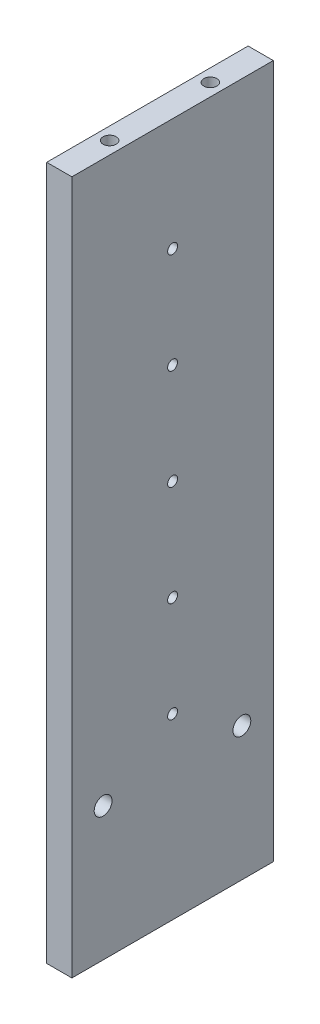
ISO-10303-21;
HEADER;
FILE_DESCRIPTION(('STEP AP214'),'2;1');
FILE_NAME('part.step','',(''),(''),'','','');
FILE_SCHEMA(('AUTOMOTIVE_DESIGN { 1 0 10303 214 1 1 1 1 }'));
ENDSEC;
DATA;
#1=APPLICATION_CONTEXT('core data for automotive mechanical design processes');
#2=APPLICATION_PROTOCOL_DEFINITION('international standard','automotive_design',2000,#1);
#3=PRODUCT_CONTEXT('',#1,'mechanical');
#4=PRODUCT('Part','Part','',(#3));
#5=PRODUCT_RELATED_PRODUCT_CATEGORY('part','',(#4));
#6=PRODUCT_DEFINITION_FORMATION('','',#4);
#7=PRODUCT_DEFINITION_CONTEXT('part definition',#1,'design');
#8=PRODUCT_DEFINITION('design','',#6,#7);
#9=PRODUCT_DEFINITION_SHAPE('','',#8);
#10=(LENGTH_UNIT() NAMED_UNIT(*) SI_UNIT(.MILLI.,.METRE.));
#11=(NAMED_UNIT(*) PLANE_ANGLE_UNIT() SI_UNIT($,.RADIAN.));
#12=(NAMED_UNIT(*) SI_UNIT($,.STERADIAN.) SOLID_ANGLE_UNIT());
#13=UNCERTAINTY_MEASURE_WITH_UNIT(LENGTH_MEASURE(1.E-05),#10,'distance_accuracy_value','');
#14=(GEOMETRIC_REPRESENTATION_CONTEXT(3) GLOBAL_UNCERTAINTY_ASSIGNED_CONTEXT((#13)) GLOBAL_UNIT_ASSIGNED_CONTEXT((#10,
#11,#12)) REPRESENTATION_CONTEXT('',''));
#15=CARTESIAN_POINT('',(0.,0.,0.));
#16=DIRECTION('',(0.,0.,1.));
#17=DIRECTION('',(1.,0.,0.));
#18=AXIS2_PLACEMENT_3D('',#15,#16,#17);
#19=CARTESIAN_POINT('',(0.,175.,0.));
#20=DIRECTION('',(1.,0.,0.));
#21=DIRECTION('',(0.,0.,-1.));
#22=AXIS2_PLACEMENT_3D('',#19,#20,#21);
#23=PLANE('',#22);
#24=CARTESIAN_POINT('',(0.,33.675,-1.524));
#25=DIRECTION('',(1.,0.,0.));
#26=DIRECTION('',(0.,0.,-1.));
#27=AXIS2_PLACEMENT_3D('',#24,#25,#26);
#28=CIRCLE('',#27,2.25);
#29=CARTESIAN_POINT('',(0.,33.675,-3.774));
#30=VERTEX_POINT('',#29);
#31=EDGE_CURVE('E119',#30,#30,#28,.T.);
#32=ORIENTED_EDGE('',*,*,#31,.T.);
#33=EDGE_LOOP('',(#32));
#34=FACE_BOUND('',#33,.T.);
#35=CARTESIAN_POINT('',(0.,33.675,-36.524));
#36=DIRECTION('',(1.,0.,0.));
#37=DIRECTION('',(0.,0.,-1.));
#38=AXIS2_PLACEMENT_3D('',#35,#36,#37);
#39=CIRCLE('',#38,2.25);
#40=CARTESIAN_POINT('',(0.,33.675,-38.774));
#41=VERTEX_POINT('',#40);
#42=EDGE_CURVE('E127',#41,#41,#39,.T.);
#43=ORIENTED_EDGE('',*,*,#42,.T.);
#44=EDGE_LOOP('',(#43));
#45=FACE_BOUND('',#44,.T.);
#46=CARTESIAN_POINT('',(0.,121.2,-19.05));
#47=DIRECTION('',(1.,0.,0.));
#48=DIRECTION('',(0.,0.,-1.));
#49=AXIS2_PLACEMENT_3D('',#46,#47,#48);
#50=CIRCLE('',#49,1.25);
#51=CARTESIAN_POINT('',(0.,121.2,-20.3));
#52=VERTEX_POINT('',#51);
#53=EDGE_CURVE('E169',#52,#52,#50,.T.);
#54=ORIENTED_EDGE('',*,*,#53,.T.);
#55=EDGE_LOOP('',(#54));
#56=FACE_BOUND('',#55,.T.);
#57=CARTESIAN_POINT('',(0.,95.8,-19.05));
#58=DIRECTION('',(1.,0.,0.));
#59=DIRECTION('',(0.,0.,-1.));
#60=AXIS2_PLACEMENT_3D('',#57,#58,#59);
#61=CIRCLE('',#60,1.25);
#62=CARTESIAN_POINT('',(0.,95.8,-20.3));
#63=VERTEX_POINT('',#62);
#64=EDGE_CURVE('E177',#63,#63,#61,.T.);
#65=ORIENTED_EDGE('',*,*,#64,.T.);
#66=EDGE_LOOP('',(#65));
#67=FACE_BOUND('',#66,.T.);
#68=CARTESIAN_POINT('',(0.,70.4,-19.05));
#69=DIRECTION('',(1.,0.,0.));
#70=DIRECTION('',(0.,0.,-1.));
#71=AXIS2_PLACEMENT_3D('',#68,#69,#70);
#72=CIRCLE('',#71,1.25);
#73=CARTESIAN_POINT('',(0.,70.4,-20.3));
#74=VERTEX_POINT('',#73);
#75=EDGE_CURVE('E185',#74,#74,#72,.T.);
#76=ORIENTED_EDGE('',*,*,#75,.T.);
#77=EDGE_LOOP('',(#76));
#78=FACE_BOUND('',#77,.T.);
#79=CARTESIAN_POINT('',(0.,45.,-19.05));
#80=DIRECTION('',(1.,0.,0.));
#81=DIRECTION('',(0.,0.,-1.));
#82=AXIS2_PLACEMENT_3D('',#79,#80,#81);
#83=CIRCLE('',#82,1.25);
#84=CARTESIAN_POINT('',(0.,45.,-20.3));
#85=VERTEX_POINT('',#84);
#86=EDGE_CURVE('E193',#85,#85,#83,.T.);
#87=ORIENTED_EDGE('',*,*,#86,.T.);
#88=EDGE_LOOP('',(#87));
#89=FACE_BOUND('',#88,.T.);
#90=CARTESIAN_POINT('',(0.,146.6,-19.05));
#91=DIRECTION('',(1.,0.,0.));
#92=DIRECTION('',(0.,0.,-1.));
#93=AXIS2_PLACEMENT_3D('',#90,#91,#92);
#94=CIRCLE('',#93,1.25);
#95=CARTESIAN_POINT('',(0.,146.6,-20.3));
#96=VERTEX_POINT('',#95);
#97=EDGE_CURVE('E201',#96,#96,#94,.T.);
#98=ORIENTED_EDGE('',*,*,#97,.T.);
#99=EDGE_LOOP('',(#98));
#100=FACE_BOUND('',#99,.T.);
#101=DIRECTION('',(0.,0.,1.));
#102=VECTOR('',#101,1.);
#103=CARTESIAN_POINT('',(0.,0.,0.));
#104=LINE('',#103,#102);
#105=CARTESIAN_POINT('',(0.,0.,-44.45));
#106=VERTEX_POINT('',#105);
#107=CARTESIAN_POINT('',(0.,0.,6.34999999999998));
#108=VERTEX_POINT('',#107);
#109=EDGE_CURVE('E220',#106,#108,#104,.T.);
#110=ORIENTED_EDGE('',*,*,#109,.T.);
#111=DIRECTION('',(0.,-1.,0.));
#112=VECTOR('',#111,1.);
#113=CARTESIAN_POINT('',(0.,175.,6.35));
#114=LINE('',#113,#112);
#115=CARTESIAN_POINT('',(0.,175.,6.35));
#116=VERTEX_POINT('',#115);
#117=EDGE_CURVE('E150',#116,#108,#114,.T.);
#118=ORIENTED_EDGE('',*,*,#117,.F.);
#119=DIRECTION('',(0.,0.,1.));
#120=VECTOR('',#119,1.);
#121=CARTESIAN_POINT('',(0.,175.,0.));
#122=LINE('',#121,#120);
#123=CARTESIAN_POINT('',(0.,175.,-44.45));
#124=VERTEX_POINT('',#123);
#125=EDGE_CURVE('E54',#124,#116,#122,.T.);
#126=ORIENTED_EDGE('',*,*,#125,.F.);
#127=DIRECTION('',(0.,1.,0.));
#128=VECTOR('',#127,1.);
#129=CARTESIAN_POINT('',(0.,175.,-44.45));
#130=LINE('',#129,#128);
#131=EDGE_CURVE('E135',#106,#124,#130,.T.);
#132=ORIENTED_EDGE('',*,*,#131,.F.);
#133=EDGE_LOOP('',(#110,#118,#126,#132));
#134=FACE_BOUND('',#133,.T.);
#135=ADVANCED_FACE('F45',(#34,#45,#56,#67,#78,#89,#100,#134),#23,.F.);
#136=CARTESIAN_POINT('',(6.35,175.,0.));
#137=DIRECTION('',(-1.,0.,0.));
#138=DIRECTION('',(0.,0.,1.));
#139=AXIS2_PLACEMENT_3D('',#136,#137,#138);
#140=PLANE('',#139);
#141=CARTESIAN_POINT('',(6.35,33.675,-1.524));
#142=DIRECTION('',(1.,0.,0.));
#143=DIRECTION('',(0.,0.,-1.));
#144=AXIS2_PLACEMENT_3D('',#141,#142,#143);
#145=CIRCLE('',#144,2.25);
#146=CARTESIAN_POINT('',(6.35,33.675,-3.774));
#147=VERTEX_POINT('',#146);
#148=EDGE_CURVE('E118',#147,#147,#145,.T.);
#149=ORIENTED_EDGE('',*,*,#148,.F.);
#150=EDGE_LOOP('',(#149));
#151=FACE_BOUND('',#150,.T.);
#152=CARTESIAN_POINT('',(6.35,33.675,-36.524));
#153=DIRECTION('',(1.,0.,0.));
#154=DIRECTION('',(0.,0.,-1.));
#155=AXIS2_PLACEMENT_3D('',#152,#153,#154);
#156=CIRCLE('',#155,2.25);
#157=CARTESIAN_POINT('',(6.35,33.675,-38.774));
#158=VERTEX_POINT('',#157);
#159=EDGE_CURVE('E123',#158,#158,#156,.T.);
#160=ORIENTED_EDGE('',*,*,#159,.F.);
#161=EDGE_LOOP('',(#160));
#162=FACE_BOUND('',#161,.T.);
#163=CARTESIAN_POINT('',(6.35,121.2,-19.05));
#164=DIRECTION('',(1.,0.,0.));
#165=DIRECTION('',(0.,0.,-1.));
#166=AXIS2_PLACEMENT_3D('',#163,#164,#165);
#167=CIRCLE('',#166,1.25);
#168=CARTESIAN_POINT('',(6.35,121.2,-20.3));
#169=VERTEX_POINT('',#168);
#170=EDGE_CURVE('E162',#169,#169,#167,.T.);
#171=ORIENTED_EDGE('',*,*,#170,.F.);
#172=EDGE_LOOP('',(#171));
#173=FACE_BOUND('',#172,.T.);
#174=CARTESIAN_POINT('',(6.35,95.8,-19.05));
#175=DIRECTION('',(1.,0.,0.));
#176=DIRECTION('',(0.,0.,-1.));
#177=AXIS2_PLACEMENT_3D('',#174,#175,#176);
#178=CIRCLE('',#177,1.25);
#179=CARTESIAN_POINT('',(6.35,95.8,-20.3));
#180=VERTEX_POINT('',#179);
#181=EDGE_CURVE('E173',#180,#180,#178,.T.);
#182=ORIENTED_EDGE('',*,*,#181,.F.);
#183=EDGE_LOOP('',(#182));
#184=FACE_BOUND('',#183,.T.);
#185=CARTESIAN_POINT('',(6.35,70.4,-19.05));
#186=DIRECTION('',(1.,0.,0.));
#187=DIRECTION('',(0.,0.,-1.));
#188=AXIS2_PLACEMENT_3D('',#185,#186,#187);
#189=CIRCLE('',#188,1.25);
#190=CARTESIAN_POINT('',(6.35,70.4,-20.3));
#191=VERTEX_POINT('',#190);
#192=EDGE_CURVE('E181',#191,#191,#189,.T.);
#193=ORIENTED_EDGE('',*,*,#192,.F.);
#194=EDGE_LOOP('',(#193));
#195=FACE_BOUND('',#194,.T.);
#196=CARTESIAN_POINT('',(6.35,45.,-19.05));
#197=DIRECTION('',(1.,0.,0.));
#198=DIRECTION('',(0.,0.,-1.));
#199=AXIS2_PLACEMENT_3D('',#196,#197,#198);
#200=CIRCLE('',#199,1.25);
#201=CARTESIAN_POINT('',(6.35,45.,-20.3));
#202=VERTEX_POINT('',#201);
#203=EDGE_CURVE('E189',#202,#202,#200,.T.);
#204=ORIENTED_EDGE('',*,*,#203,.F.);
#205=EDGE_LOOP('',(#204));
#206=FACE_BOUND('',#205,.T.);
#207=CARTESIAN_POINT('',(6.35,146.6,-19.05));
#208=DIRECTION('',(1.,0.,0.));
#209=DIRECTION('',(0.,0.,-1.));
#210=AXIS2_PLACEMENT_3D('',#207,#208,#209);
#211=CIRCLE('',#210,1.25);
#212=CARTESIAN_POINT('',(6.35,146.6,-20.3));
#213=VERTEX_POINT('',#212);
#214=EDGE_CURVE('E197',#213,#213,#211,.T.);
#215=ORIENTED_EDGE('',*,*,#214,.F.);
#216=EDGE_LOOP('',(#215));
#217=FACE_BOUND('',#216,.T.);
#218=DIRECTION('',(0.,0.,-1.));
#219=VECTOR('',#218,1.);
#220=CARTESIAN_POINT('',(6.35,0.,0.));
#221=LINE('',#220,#219);
#222=CARTESIAN_POINT('',(6.35,0.,6.34999999999998));
#223=VERTEX_POINT('',#222);
#224=CARTESIAN_POINT('',(6.35,0.,-44.45));
#225=VERTEX_POINT('',#224);
#226=EDGE_CURVE('E48',#223,#225,#221,.T.);
#227=ORIENTED_EDGE('',*,*,#226,.T.);
#228=DIRECTION('',(0.,1.,0.));
#229=VECTOR('',#228,1.);
#230=CARTESIAN_POINT('',(6.35,175.,-44.45));
#231=LINE('',#230,#229);
#232=CARTESIAN_POINT('',(6.35,175.,-44.45));
#233=VERTEX_POINT('',#232);
#234=EDGE_CURVE('E131',#225,#233,#231,.T.);
#235=ORIENTED_EDGE('',*,*,#234,.T.);
#236=DIRECTION('',(0.,0.,-1.));
#237=VECTOR('',#236,1.);
#238=CARTESIAN_POINT('',(6.35,175.,0.));
#239=LINE('',#238,#237);
#240=CARTESIAN_POINT('',(6.35,175.,6.35));
#241=VERTEX_POINT('',#240);
#242=EDGE_CURVE('E11',#241,#233,#239,.T.);
#243=ORIENTED_EDGE('',*,*,#242,.F.);
#244=DIRECTION('',(0.,-1.,0.));
#245=VECTOR('',#244,1.);
#246=CARTESIAN_POINT('',(6.35,175.,6.35));
#247=LINE('',#246,#245);
#248=EDGE_CURVE('E146',#241,#223,#247,.T.);
#249=ORIENTED_EDGE('',*,*,#248,.T.);
#250=EDGE_LOOP('',(#227,#235,#243,#249));
#251=FACE_BOUND('',#250,.T.);
#252=ADVANCED_FACE('F229',(#151,#162,#173,#184,#195,#206,#217,#251),#140,.F.);
#253=CARTESIAN_POINT('',(0.,175.,0.));
#254=DIRECTION('',(0.,-1.,0.));
#255=DIRECTION('',(0.,0.,-1.));
#256=AXIS2_PLACEMENT_3D('',#253,#254,#255);
#257=PLANE('',#256);
#258=CARTESIAN_POINT('',(3.175,175.,-31.75));
#259=DIRECTION('',(0.,1.,0.));
#260=DIRECTION('',(0.,0.,1.));
#261=AXIS2_PLACEMENT_3D('',#258,#259,#260);
#262=CIRCLE('',#261,1.65);
#263=CARTESIAN_POINT('',(3.175,175.,-30.1));
#264=VERTEX_POINT('',#263);
#265=EDGE_CURVE('E205',#264,#264,#262,.T.);
#266=ORIENTED_EDGE('',*,*,#265,.F.);
#267=EDGE_LOOP('',(#266));
#268=FACE_BOUND('',#267,.T.);
#269=CARTESIAN_POINT('',(3.175,175.,-6.35));
#270=DIRECTION('',(0.,1.,0.));
#271=DIRECTION('',(0.,0.,1.));
#272=AXIS2_PLACEMENT_3D('',#269,#270,#271);
#273=CIRCLE('',#272,1.65);
#274=CARTESIAN_POINT('',(3.175,175.,-4.7));
#275=VERTEX_POINT('',#274);
#276=EDGE_CURVE('E212',#275,#275,#273,.T.);
#277=ORIENTED_EDGE('',*,*,#276,.F.);
#278=EDGE_LOOP('',(#277));
#279=FACE_BOUND('',#278,.T.);
#280=ORIENTED_EDGE('',*,*,#125,.T.);
#281=DIRECTION('',(1.,0.,0.));
#282=VECTOR('',#281,1.);
#283=CARTESIAN_POINT('',(0.,175.,6.35));
#284=LINE('',#283,#282);
#285=EDGE_CURVE('E154',#116,#241,#284,.T.);
#286=ORIENTED_EDGE('',*,*,#285,.T.);
#287=ORIENTED_EDGE('',*,*,#242,.T.);
#288=DIRECTION('',(1.,0.,0.));
#289=VECTOR('',#288,1.);
#290=CARTESIAN_POINT('',(0.,175.,-44.45));
#291=LINE('',#290,#289);
#292=EDGE_CURVE('E143',#124,#233,#291,.T.);
#293=ORIENTED_EDGE('',*,*,#292,.F.);
#294=EDGE_LOOP('',(#280,#286,#287,#293));
#295=FACE_BOUND('',#294,.T.);
#296=ADVANCED_FACE('F239',(#268,#279,#295),#257,.F.);
#297=CARTESIAN_POINT('',(0.,0.,0.));
#298=DIRECTION('',(0.,-1.,0.));
#299=DIRECTION('',(0.,0.,-1.));
#300=AXIS2_PLACEMENT_3D('',#297,#298,#299);
#301=PLANE('',#300);
#302=CARTESIAN_POINT('',(3.175,0.,-6.35000000000003));
#303=DIRECTION('',(0.,-1.,0.));
#304=DIRECTION('',(0.,0.,-1.));
#305=AXIS2_PLACEMENT_3D('',#302,#303,#304);
#306=CIRCLE('',#305,1.64999999999999);
#307=CARTESIAN_POINT('',(3.175,0.,-8.00000000000002));
#308=VERTEX_POINT('',#307);
#309=EDGE_CURVE('E103',#308,#308,#306,.T.);
#310=ORIENTED_EDGE('',*,*,#309,.F.);
#311=EDGE_LOOP('',(#310));
#312=FACE_BOUND('',#311,.T.);
#313=CARTESIAN_POINT('',(3.175,0.,-31.75));
#314=DIRECTION('',(0.,-1.,0.));
#315=DIRECTION('',(0.,0.,-1.));
#316=AXIS2_PLACEMENT_3D('',#313,#314,#315);
#317=CIRCLE('',#316,1.64999999999999);
#318=CARTESIAN_POINT('',(3.175,0.,-33.4));
#319=VERTEX_POINT('',#318);
#320=EDGE_CURVE('E102',#319,#319,#317,.T.);
#321=ORIENTED_EDGE('',*,*,#320,.F.);
#322=EDGE_LOOP('',(#321));
#323=FACE_BOUND('',#322,.T.);
#324=ORIENTED_EDGE('',*,*,#109,.F.);
#325=DIRECTION('',(1.,0.,0.));
#326=VECTOR('',#325,1.);
#327=CARTESIAN_POINT('',(0.,0.,-44.45));
#328=LINE('',#327,#326);
#329=EDGE_CURVE('E139',#106,#225,#328,.T.);
#330=ORIENTED_EDGE('',*,*,#329,.T.);
#331=ORIENTED_EDGE('',*,*,#226,.F.);
#332=DIRECTION('',(1.,0.,0.));
#333=VECTOR('',#332,1.);
#334=CARTESIAN_POINT('',(0.,0.,6.34999999999998));
#335=LINE('',#334,#333);
#336=EDGE_CURVE('E158',#108,#223,#335,.T.);
#337=ORIENTED_EDGE('',*,*,#336,.F.);
#338=EDGE_LOOP('',(#324,#330,#331,#337));
#339=FACE_BOUND('',#338,.T.);
#340=ADVANCED_FACE('F234',(#312,#323,#339),#301,.T.);
#341=CARTESIAN_POINT('',(3.175,164.9,-6.35));
#342=DIRECTION('',(0.,1.,0.));
#343=DIRECTION('',(0.,0.,1.));
#344=AXIS2_PLACEMENT_3D('',#341,#342,#343);
#345=CONICAL_SURFACE('',#344,1.65,1.02974425867665);
#346=CARTESIAN_POINT('',(3.175,163.908579978605,-6.35));
#347=VERTEX_POINT('',#346);
#348=VERTEX_LOOP('',#347);
#349=FACE_BOUND('',#348,.T.);
#350=CARTESIAN_POINT('',(3.175,164.9,-6.35));
#351=DIRECTION('',(0.,1.,0.));
#352=DIRECTION('',(0.,0.,1.));
#353=AXIS2_PLACEMENT_3D('',#350,#351,#352);
#354=CIRCLE('',#353,1.65);
#355=CARTESIAN_POINT('',(3.175,164.9,-4.7));
#356=VERTEX_POINT('',#355);
#357=EDGE_CURVE('E216',#356,#356,#354,.T.);
#358=ORIENTED_EDGE('',*,*,#357,.T.);
#359=EDGE_LOOP('',(#358));
#360=FACE_BOUND('',#359,.T.);
#361=ADVANCED_FACE('F288',(#349,#360),#345,.F.);
#362=CARTESIAN_POINT('',(3.175,175.,-6.35));
#363=DIRECTION('',(0.,1.,0.));
#364=DIRECTION('',(0.,0.,1.));
#365=AXIS2_PLACEMENT_3D('',#362,#363,#364);
#366=CYLINDRICAL_SURFACE('',#365,1.65);
#367=ORIENTED_EDGE('',*,*,#357,.F.);
#368=EDGE_LOOP('',(#367));
#369=FACE_BOUND('',#368,.T.);
#370=ORIENTED_EDGE('',*,*,#276,.T.);
#371=EDGE_LOOP('',(#370));
#372=FACE_BOUND('',#371,.T.);
#373=ADVANCED_FACE('F285',(#369,#372),#366,.F.);
#374=CARTESIAN_POINT('',(3.175,164.9,-31.75));
#375=DIRECTION('',(0.,1.,0.));
#376=DIRECTION('',(0.,0.,1.));
#377=AXIS2_PLACEMENT_3D('',#374,#375,#376);
#378=CONICAL_SURFACE('',#377,1.65,1.02974425867665);
#379=CARTESIAN_POINT('',(3.175,163.908579978605,-31.75));
#380=VERTEX_POINT('',#379);
#381=VERTEX_LOOP('',#380);
#382=FACE_BOUND('',#381,.T.);
#383=CARTESIAN_POINT('',(3.175,164.9,-31.75));
#384=DIRECTION('',(0.,1.,0.));
#385=DIRECTION('',(0.,0.,1.));
#386=AXIS2_PLACEMENT_3D('',#383,#384,#385);
#387=CIRCLE('',#386,1.65);
#388=CARTESIAN_POINT('',(3.175,164.9,-30.1));
#389=VERTEX_POINT('',#388);
#390=EDGE_CURVE('E208',#389,#389,#387,.T.);
#391=ORIENTED_EDGE('',*,*,#390,.T.);
#392=EDGE_LOOP('',(#391));
#393=FACE_BOUND('',#392,.T.);
#394=ADVANCED_FACE('F278',(#382,#393),#378,.F.);
#395=CARTESIAN_POINT('',(3.175,175.,-31.75));
#396=DIRECTION('',(0.,1.,0.));
#397=DIRECTION('',(0.,0.,1.));
#398=AXIS2_PLACEMENT_3D('',#395,#396,#397);
#399=CYLINDRICAL_SURFACE('',#398,1.65);
#400=ORIENTED_EDGE('',*,*,#390,.F.);
#401=EDGE_LOOP('',(#400));
#402=FACE_BOUND('',#401,.T.);
#403=ORIENTED_EDGE('',*,*,#265,.T.);
#404=EDGE_LOOP('',(#403));
#405=FACE_BOUND('',#404,.T.);
#406=ADVANCED_FACE('F267',(#402,#405),#399,.F.);
#407=CARTESIAN_POINT('',(6.35,146.6,-19.05));
#408=DIRECTION('',(1.,0.,0.));
#409=DIRECTION('',(0.,0.,-1.));
#410=AXIS2_PLACEMENT_3D('',#407,#408,#409);
#411=CYLINDRICAL_SURFACE('',#410,1.25);
#412=ORIENTED_EDGE('',*,*,#97,.F.);
#413=EDGE_LOOP('',(#412));
#414=FACE_BOUND('',#413,.T.);
#415=ORIENTED_EDGE('',*,*,#214,.T.);
#416=EDGE_LOOP('',(#415));
#417=FACE_BOUND('',#416,.T.);
#418=ADVANCED_FACE('F263',(#414,#417),#411,.F.);
#419=CARTESIAN_POINT('',(6.35,45.,-19.05));
#420=DIRECTION('',(1.,0.,0.));
#421=DIRECTION('',(0.,0.,-1.));
#422=AXIS2_PLACEMENT_3D('',#419,#420,#421);
#423=CYLINDRICAL_SURFACE('',#422,1.25);
#424=ORIENTED_EDGE('',*,*,#86,.F.);
#425=EDGE_LOOP('',(#424));
#426=FACE_BOUND('',#425,.T.);
#427=ORIENTED_EDGE('',*,*,#203,.T.);
#428=EDGE_LOOP('',(#427));
#429=FACE_BOUND('',#428,.T.);
#430=ADVANCED_FACE('F266',(#426,#429),#423,.F.);
#431=CARTESIAN_POINT('',(6.35,70.4,-19.05));
#432=DIRECTION('',(1.,0.,0.));
#433=DIRECTION('',(0.,0.,-1.));
#434=AXIS2_PLACEMENT_3D('',#431,#432,#433);
#435=CYLINDRICAL_SURFACE('',#434,1.25);
#436=ORIENTED_EDGE('',*,*,#75,.F.);
#437=EDGE_LOOP('',(#436));
#438=FACE_BOUND('',#437,.T.);
#439=ORIENTED_EDGE('',*,*,#192,.T.);
#440=EDGE_LOOP('',(#439));
#441=FACE_BOUND('',#440,.T.);
#442=ADVANCED_FACE('F275',(#438,#441),#435,.F.);
#443=CARTESIAN_POINT('',(6.35,95.8,-19.05));
#444=DIRECTION('',(1.,0.,0.));
#445=DIRECTION('',(0.,0.,-1.));
#446=AXIS2_PLACEMENT_3D('',#443,#444,#445);
#447=CYLINDRICAL_SURFACE('',#446,1.25);
#448=ORIENTED_EDGE('',*,*,#64,.F.);
#449=EDGE_LOOP('',(#448));
#450=FACE_BOUND('',#449,.T.);
#451=ORIENTED_EDGE('',*,*,#181,.T.);
#452=EDGE_LOOP('',(#451));
#453=FACE_BOUND('',#452,.T.);
#454=ADVANCED_FACE('F330',(#450,#453),#447,.F.);
#455=CARTESIAN_POINT('',(6.35,121.2,-19.05));
#456=DIRECTION('',(1.,0.,0.));
#457=DIRECTION('',(0.,0.,-1.));
#458=AXIS2_PLACEMENT_3D('',#455,#456,#457);
#459=CYLINDRICAL_SURFACE('',#458,1.25);
#460=ORIENTED_EDGE('',*,*,#53,.F.);
#461=EDGE_LOOP('',(#460));
#462=FACE_BOUND('',#461,.T.);
#463=ORIENTED_EDGE('',*,*,#170,.T.);
#464=EDGE_LOOP('',(#463));
#465=FACE_BOUND('',#464,.T.);
#466=ADVANCED_FACE('F327',(#462,#465),#459,.F.);
#467=CARTESIAN_POINT('',(0.,175.,6.35));
#468=DIRECTION('',(0.,0.,1.));
#469=DIRECTION('',(0.,-1.,0.));
#470=AXIS2_PLACEMENT_3D('',#467,#468,#469);
#471=PLANE('',#470);
#472=ORIENTED_EDGE('',*,*,#248,.F.);
#473=ORIENTED_EDGE('',*,*,#285,.F.);
#474=ORIENTED_EDGE('',*,*,#117,.T.);
#475=ORIENTED_EDGE('',*,*,#336,.T.);
#476=EDGE_LOOP('',(#472,#473,#474,#475));
#477=FACE_BOUND('',#476,.T.);
#478=ADVANCED_FACE('F242',(#477),#471,.T.);
#479=CARTESIAN_POINT('',(0.,175.,-44.45));
#480=DIRECTION('',(0.,0.,-1.));
#481=DIRECTION('',(0.,1.,0.));
#482=AXIS2_PLACEMENT_3D('',#479,#480,#481);
#483=PLANE('',#482);
#484=ORIENTED_EDGE('',*,*,#234,.F.);
#485=ORIENTED_EDGE('',*,*,#329,.F.);
#486=ORIENTED_EDGE('',*,*,#131,.T.);
#487=ORIENTED_EDGE('',*,*,#292,.T.);
#488=EDGE_LOOP('',(#484,#485,#486,#487));
#489=FACE_BOUND('',#488,.T.);
#490=ADVANCED_FACE('F236',(#489),#483,.T.);
#491=CARTESIAN_POINT('',(0.,33.675,-36.524));
#492=DIRECTION('',(1.,0.,0.));
#493=DIRECTION('',(0.,0.,-1.));
#494=AXIS2_PLACEMENT_3D('',#491,#492,#493);
#495=CYLINDRICAL_SURFACE('',#494,2.25);
#496=ORIENTED_EDGE('',*,*,#42,.F.);
#497=EDGE_LOOP('',(#496));
#498=FACE_BOUND('',#497,.T.);
#499=ORIENTED_EDGE('',*,*,#159,.T.);
#500=EDGE_LOOP('',(#499));
#501=FACE_BOUND('',#500,.T.);
#502=ADVANCED_FACE('F318',(#498,#501),#495,.F.);
#503=CARTESIAN_POINT('',(0.,33.675,-1.524));
#504=DIRECTION('',(1.,0.,0.));
#505=DIRECTION('',(0.,0.,-1.));
#506=AXIS2_PLACEMENT_3D('',#503,#504,#505);
#507=CYLINDRICAL_SURFACE('',#506,2.25);
#508=ORIENTED_EDGE('',*,*,#31,.F.);
#509=EDGE_LOOP('',(#508));
#510=FACE_BOUND('',#509,.T.);
#511=ORIENTED_EDGE('',*,*,#148,.T.);
#512=EDGE_LOOP('',(#511));
#513=FACE_BOUND('',#512,.T.);
#514=ADVANCED_FACE('F310',(#510,#513),#507,.F.);
#515=CARTESIAN_POINT('',(3.175,25.4,-31.75));
#516=DIRECTION('',(0.,-1.,0.));
#517=DIRECTION('',(0.,0.,-1.));
#518=AXIS2_PLACEMENT_3D('',#515,#516,#517);
#519=CONICAL_SURFACE('',#518,1.65,1.02974425867665);
#520=CARTESIAN_POINT('',(3.17499999999999,26.3914200213955,-31.75));
#521=VERTEX_POINT('',#520);
#522=VERTEX_LOOP('',#521);
#523=FACE_BOUND('',#522,.T.);
#524=CARTESIAN_POINT('',(3.175,25.4,-31.75));
#525=DIRECTION('',(0.,-1.,0.));
#526=DIRECTION('',(0.,0.,-1.));
#527=AXIS2_PLACEMENT_3D('',#524,#525,#526);
#528=CIRCLE('',#527,1.65);
#529=CARTESIAN_POINT('',(3.175,25.4,-33.4));
#530=VERTEX_POINT('',#529);
#531=EDGE_CURVE('E109',#530,#530,#528,.T.);
#532=ORIENTED_EDGE('',*,*,#531,.T.);
#533=EDGE_LOOP('',(#532));
#534=FACE_BOUND('',#533,.T.);
#535=ADVANCED_FACE('F304',(#523,#534),#519,.F.);
#536=CARTESIAN_POINT('',(3.175,0.,-31.75));
#537=DIRECTION('',(0.,-1.,0.));
#538=DIRECTION('',(0.,0.,-1.));
#539=AXIS2_PLACEMENT_3D('',#536,#537,#538);
#540=CYLINDRICAL_SURFACE('',#539,1.64999999999999);
#541=ORIENTED_EDGE('',*,*,#531,.F.);
#542=EDGE_LOOP('',(#541));
#543=FACE_BOUND('',#542,.T.);
#544=ORIENTED_EDGE('',*,*,#320,.T.);
#545=EDGE_LOOP('',(#544));
#546=FACE_BOUND('',#545,.T.);
#547=ADVANCED_FACE('F95',(#543,#546),#540,.F.);
#548=CARTESIAN_POINT('',(3.175,25.4,-6.35000000000003));
#549=DIRECTION('',(0.,-1.,0.));
#550=DIRECTION('',(0.,0.,-1.));
#551=AXIS2_PLACEMENT_3D('',#548,#549,#550);
#552=CONICAL_SURFACE('',#551,1.65,1.02974425867665);
#553=CARTESIAN_POINT('',(3.17499999999999,26.3914200213955,-6.35000000000003));
#554=VERTEX_POINT('',#553);
#555=VERTEX_LOOP('',#554);
#556=FACE_BOUND('',#555,.T.);
#557=CARTESIAN_POINT('',(3.175,25.4,-6.35000000000003));
#558=DIRECTION('',(0.,-1.,0.));
#559=DIRECTION('',(0.,0.,-1.));
#560=AXIS2_PLACEMENT_3D('',#557,#558,#559);
#561=CIRCLE('',#560,1.65);
#562=CARTESIAN_POINT('',(3.175,25.4,-8.00000000000002));
#563=VERTEX_POINT('',#562);
#564=EDGE_CURVE('E99',#563,#563,#561,.T.);
#565=ORIENTED_EDGE('',*,*,#564,.T.);
#566=EDGE_LOOP('',(#565));
#567=FACE_BOUND('',#566,.T.);
#568=ADVANCED_FACE('F91',(#556,#567),#552,.F.);
#569=CARTESIAN_POINT('',(3.175,0.,-6.35000000000003));
#570=DIRECTION('',(0.,-1.,0.));
#571=DIRECTION('',(0.,0.,-1.));
#572=AXIS2_PLACEMENT_3D('',#569,#570,#571);
#573=CYLINDRICAL_SURFACE('',#572,1.64999999999999);
#574=ORIENTED_EDGE('',*,*,#564,.F.);
#575=EDGE_LOOP('',(#574));
#576=FACE_BOUND('',#575,.T.);
#577=ORIENTED_EDGE('',*,*,#309,.T.);
#578=EDGE_LOOP('',(#577));
#579=FACE_BOUND('',#578,.T.);
#580=ADVANCED_FACE('F94',(#576,#579),#573,.F.);
#581=CLOSED_SHELL('',(#135,#252,#296,#340,#361,#373,#394,#406,#418,#430,#442,#454,#466,#478,
#490,#502,#514,#535,#547,#568,#580));
#582=MANIFOLD_SOLID_BREP('B2',#581);
#583=ADVANCED_BREP_SHAPE_REPRESENTATION('',(#18,#582),#14);
#584=SHAPE_DEFINITION_REPRESENTATION(#9,#583);
ENDSEC;
END-ISO-10303-21;
